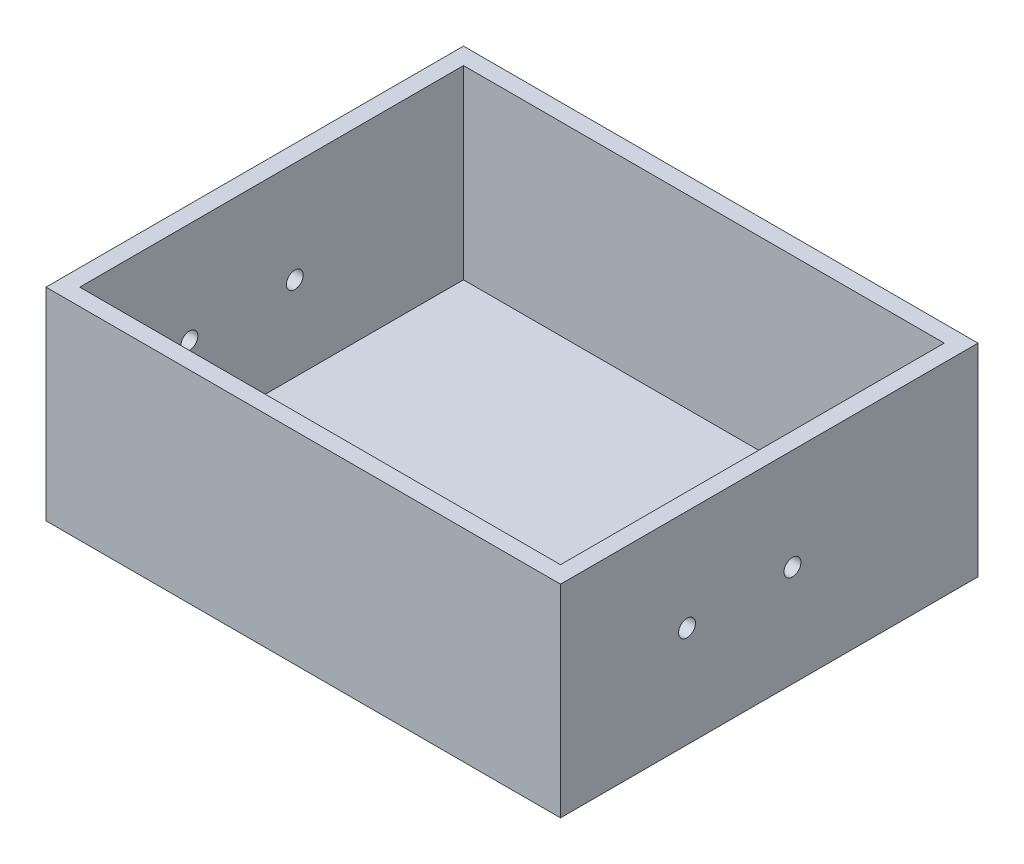
ISO-10303-21;
HEADER;
FILE_DESCRIPTION(('STEP AP214'),'2;1');
FILE_NAME('part.step','',(''),(''),'','','');
FILE_SCHEMA(('AUTOMOTIVE_DESIGN { 1 0 10303 214 1 1 1 1 }'));
ENDSEC;
DATA;
#1=APPLICATION_CONTEXT('core data for automotive mechanical design processes');
#2=APPLICATION_PROTOCOL_DEFINITION('international standard','automotive_design',2000,#1);
#3=PRODUCT_CONTEXT('',#1,'mechanical');
#4=PRODUCT('Part','Part','',(#3));
#5=PRODUCT_RELATED_PRODUCT_CATEGORY('part','',(#4));
#6=PRODUCT_DEFINITION_FORMATION('','',#4);
#7=PRODUCT_DEFINITION_CONTEXT('part definition',#1,'design');
#8=PRODUCT_DEFINITION('design','',#6,#7);
#9=PRODUCT_DEFINITION_SHAPE('','',#8);
#10=(LENGTH_UNIT() NAMED_UNIT(*) SI_UNIT(.MILLI.,.METRE.));
#11=(NAMED_UNIT(*) PLANE_ANGLE_UNIT() SI_UNIT($,.RADIAN.));
#12=(NAMED_UNIT(*) SI_UNIT($,.STERADIAN.) SOLID_ANGLE_UNIT());
#13=UNCERTAINTY_MEASURE_WITH_UNIT(LENGTH_MEASURE(1.E-05),#10,'distance_accuracy_value','');
#14=(GEOMETRIC_REPRESENTATION_CONTEXT(3) GLOBAL_UNCERTAINTY_ASSIGNED_CONTEXT((#13)) GLOBAL_UNIT_ASSIGNED_CONTEXT((#10,
#11,#12)) REPRESENTATION_CONTEXT('',''));
#15=CARTESIAN_POINT('',(0.,0.,0.));
#16=DIRECTION('',(0.,0.,1.));
#17=DIRECTION('',(1.,0.,0.));
#18=AXIS2_PLACEMENT_3D('',#15,#16,#17);
#19=CARTESIAN_POINT('',(-61.,48.,49.5));
#20=DIRECTION('',(1.,0.,0.));
#21=DIRECTION('',(0.,0.,-1.));
#22=AXIS2_PLACEMENT_3D('',#19,#20,#21);
#23=PLANE('',#22);
#24=CARTESIAN_POINT('',(-61.,24.,19.5));
#25=DIRECTION('',(1.,0.,0.));
#26=DIRECTION('',(0.,0.,-1.));
#27=AXIS2_PLACEMENT_3D('',#24,#25,#26);
#28=CIRCLE('',#27,2.00000000000001);
#29=CARTESIAN_POINT('',(-61.,24.,17.5));
#30=VERTEX_POINT('',#29);
#31=EDGE_CURVE('E179',#30,#30,#28,.T.);
#32=ORIENTED_EDGE('',*,*,#31,.T.);
#33=EDGE_LOOP('',(#32));
#34=FACE_BOUND('',#33,.T.);
#35=CARTESIAN_POINT('',(-61.,24.,-5.50000000000001));
#36=DIRECTION('',(1.,0.,0.));
#37=DIRECTION('',(0.,0.,-1.));
#38=AXIS2_PLACEMENT_3D('',#35,#36,#37);
#39=CIRCLE('',#38,2.);
#40=CARTESIAN_POINT('',(-61.,24.,-7.50000000000002));
#41=VERTEX_POINT('',#40);
#42=EDGE_CURVE('E194',#41,#41,#39,.T.);
#43=ORIENTED_EDGE('',*,*,#42,.T.);
#44=EDGE_LOOP('',(#43));
#45=FACE_BOUND('',#44,.T.);
#46=DIRECTION('',(0.,0.,1.));
#47=VECTOR('',#46,1.);
#48=CARTESIAN_POINT('',(-61.,0.,49.5));
#49=LINE('',#48,#47);
#50=CARTESIAN_POINT('',(-61.,0.,-49.5));
#51=VERTEX_POINT('',#50);
#52=CARTESIAN_POINT('',(-61.,0.,49.5));
#53=VERTEX_POINT('',#52);
#54=EDGE_CURVE('E154',#51,#53,#49,.T.);
#55=ORIENTED_EDGE('',*,*,#54,.T.);
#56=DIRECTION('',(0.,-1.,0.));
#57=VECTOR('',#56,1.);
#58=CARTESIAN_POINT('',(-61.,48.,49.5));
#59=LINE('',#58,#57);
#60=CARTESIAN_POINT('',(-61.,48.,49.5));
#61=VERTEX_POINT('',#60);
#62=EDGE_CURVE('E11',#61,#53,#59,.T.);
#63=ORIENTED_EDGE('',*,*,#62,.F.);
#64=DIRECTION('',(0.,0.,1.));
#65=VECTOR('',#64,1.);
#66=CARTESIAN_POINT('',(-61.,48.,49.5));
#67=LINE('',#66,#65);
#68=CARTESIAN_POINT('',(-61.,48.,-49.5));
#69=VERTEX_POINT('',#68);
#70=EDGE_CURVE('E158',#69,#61,#67,.T.);
#71=ORIENTED_EDGE('',*,*,#70,.F.);
#72=DIRECTION('',(0.,-1.,0.));
#73=VECTOR('',#72,1.);
#74=CARTESIAN_POINT('',(-61.,48.,-49.5));
#75=LINE('',#74,#73);
#76=EDGE_CURVE('E164',#69,#51,#75,.T.);
#77=ORIENTED_EDGE('',*,*,#76,.T.);
#78=EDGE_LOOP('',(#55,#63,#71,#77));
#79=FACE_BOUND('',#78,.T.);
#80=ADVANCED_FACE('F41',(#34,#45,#79),#23,.F.);
#81=CARTESIAN_POINT('',(61.,48.,49.5));
#82=DIRECTION('',(0.,0.,-1.));
#83=DIRECTION('',(-1.,0.,0.));
#84=AXIS2_PLACEMENT_3D('',#81,#82,#83);
#85=PLANE('',#84);
#86=DIRECTION('',(1.,0.,0.));
#87=VECTOR('',#86,1.);
#88=CARTESIAN_POINT('',(61.,0.,49.5));
#89=LINE('',#88,#87);
#90=CARTESIAN_POINT('',(61.,0.,49.5));
#91=VERTEX_POINT('',#90);
#92=EDGE_CURVE('E167',#53,#91,#89,.T.);
#93=ORIENTED_EDGE('',*,*,#92,.T.);
#94=DIRECTION('',(0.,-1.,0.));
#95=VECTOR('',#94,1.);
#96=CARTESIAN_POINT('',(61.,48.,49.5));
#97=LINE('',#96,#95);
#98=CARTESIAN_POINT('',(61.,48.,49.5));
#99=VERTEX_POINT('',#98);
#100=EDGE_CURVE('E49',#99,#91,#97,.T.);
#101=ORIENTED_EDGE('',*,*,#100,.F.);
#102=DIRECTION('',(1.,0.,0.));
#103=VECTOR('',#102,1.);
#104=CARTESIAN_POINT('',(61.,48.,49.5));
#105=LINE('',#104,#103);
#106=EDGE_CURVE('E94',#61,#99,#105,.T.);
#107=ORIENTED_EDGE('',*,*,#106,.F.);
#108=ORIENTED_EDGE('',*,*,#62,.T.);
#109=EDGE_LOOP('',(#93,#101,#107,#108));
#110=FACE_BOUND('',#109,.T.);
#111=ADVANCED_FACE('F217',(#110),#85,.F.);
#112=CARTESIAN_POINT('',(61.,48.,49.5));
#113=DIRECTION('',(-1.,0.,0.));
#114=DIRECTION('',(0.,0.,1.));
#115=AXIS2_PLACEMENT_3D('',#112,#113,#114);
#116=PLANE('',#115);
#117=CARTESIAN_POINT('',(61.,24.,19.5));
#118=DIRECTION('',(1.,0.,0.));
#119=DIRECTION('',(0.,0.,-1.));
#120=AXIS2_PLACEMENT_3D('',#117,#118,#119);
#121=CIRCLE('',#120,2.00000000000001);
#122=CARTESIAN_POINT('',(61.,24.,17.5));
#123=VERTEX_POINT('',#122);
#124=EDGE_CURVE('E184',#123,#123,#121,.T.);
#125=ORIENTED_EDGE('',*,*,#124,.F.);
#126=EDGE_LOOP('',(#125));
#127=FACE_BOUND('',#126,.T.);
#128=CARTESIAN_POINT('',(61.,24.,-5.50000000000001));
#129=DIRECTION('',(1.,0.,0.));
#130=DIRECTION('',(0.,0.,-1.));
#131=AXIS2_PLACEMENT_3D('',#128,#129,#130);
#132=CIRCLE('',#131,2.);
#133=CARTESIAN_POINT('',(61.,24.,-7.50000000000002));
#134=VERTEX_POINT('',#133);
#135=EDGE_CURVE('E189',#134,#134,#132,.T.);
#136=ORIENTED_EDGE('',*,*,#135,.F.);
#137=EDGE_LOOP('',(#136));
#138=FACE_BOUND('',#137,.T.);
#139=DIRECTION('',(0.,0.,-1.));
#140=VECTOR('',#139,1.);
#141=CARTESIAN_POINT('',(61.,0.,49.5));
#142=LINE('',#141,#140);
#143=CARTESIAN_POINT('',(61.,0.,-49.5));
#144=VERTEX_POINT('',#143);
#145=EDGE_CURVE('E169',#91,#144,#142,.T.);
#146=ORIENTED_EDGE('',*,*,#145,.T.);
#147=DIRECTION('',(0.,-1.,0.));
#148=VECTOR('',#147,1.);
#149=CARTESIAN_POINT('',(61.,48.,-49.5));
#150=LINE('',#149,#148);
#151=CARTESIAN_POINT('',(61.,48.,-49.5));
#152=VERTEX_POINT('',#151);
#153=EDGE_CURVE('E173',#152,#144,#150,.T.);
#154=ORIENTED_EDGE('',*,*,#153,.F.);
#155=DIRECTION('',(0.,0.,-1.));
#156=VECTOR('',#155,1.);
#157=CARTESIAN_POINT('',(61.,48.,49.5));
#158=LINE('',#157,#156);
#159=EDGE_CURVE('E161',#99,#152,#158,.T.);
#160=ORIENTED_EDGE('',*,*,#159,.F.);
#161=ORIENTED_EDGE('',*,*,#100,.T.);
#162=EDGE_LOOP('',(#146,#154,#160,#161));
#163=FACE_BOUND('',#162,.T.);
#164=ADVANCED_FACE('F221',(#127,#138,#163),#116,.F.);
#165=CARTESIAN_POINT('',(61.,48.,-49.5));
#166=DIRECTION('',(0.,0.,1.));
#167=DIRECTION('',(1.,0.,0.));
#168=AXIS2_PLACEMENT_3D('',#165,#166,#167);
#169=PLANE('',#168);
#170=DIRECTION('',(-1.,0.,0.));
#171=VECTOR('',#170,1.);
#172=CARTESIAN_POINT('',(61.,0.,-49.5));
#173=LINE('',#172,#171);
#174=EDGE_CURVE('E87',#144,#51,#173,.T.);
#175=ORIENTED_EDGE('',*,*,#174,.T.);
#176=ORIENTED_EDGE('',*,*,#76,.F.);
#177=DIRECTION('',(-1.,0.,0.));
#178=VECTOR('',#177,1.);
#179=CARTESIAN_POINT('',(61.,48.,-49.5));
#180=LINE('',#179,#178);
#181=EDGE_CURVE('E66',#152,#69,#180,.T.);
#182=ORIENTED_EDGE('',*,*,#181,.F.);
#183=ORIENTED_EDGE('',*,*,#153,.T.);
#184=EDGE_LOOP('',(#175,#176,#182,#183));
#185=FACE_BOUND('',#184,.T.);
#186=ADVANCED_FACE('F225',(#185),#169,.F.);
#187=CARTESIAN_POINT('',(0.,48.,0.));
#188=DIRECTION('',(0.,1.,0.));
#189=DIRECTION('',(0.,0.,1.));
#190=AXIS2_PLACEMENT_3D('',#187,#188,#189);
#191=PLANE('',#190);
#192=DIRECTION('',(0.,0.,-1.));
#193=VECTOR('',#192,1.);
#194=CARTESIAN_POINT('',(57.,48.,-45.5));
#195=LINE('',#194,#193);
#196=CARTESIAN_POINT('',(57.,48.,45.5));
#197=VERTEX_POINT('',#196);
#198=CARTESIAN_POINT('',(57.,48.,-45.5));
#199=VERTEX_POINT('',#198);
#200=EDGE_CURVE('E57',#197,#199,#195,.T.);
#201=ORIENTED_EDGE('',*,*,#200,.F.);
#202=DIRECTION('',(1.,0.,0.));
#203=VECTOR('',#202,1.);
#204=CARTESIAN_POINT('',(-57.,48.,45.5));
#205=LINE('',#204,#203);
#206=CARTESIAN_POINT('',(-57.,48.,45.5));
#207=VERTEX_POINT('',#206);
#208=EDGE_CURVE('E136',#207,#197,#205,.T.);
#209=ORIENTED_EDGE('',*,*,#208,.F.);
#210=DIRECTION('',(0.,0.,1.));
#211=VECTOR('',#210,1.);
#212=CARTESIAN_POINT('',(-57.,48.,-45.5));
#213=LINE('',#212,#211);
#214=CARTESIAN_POINT('',(-57.,48.,-45.5));
#215=VERTEX_POINT('',#214);
#216=EDGE_CURVE('E139',#215,#207,#213,.T.);
#217=ORIENTED_EDGE('',*,*,#216,.F.);
#218=DIRECTION('',(-1.,0.,0.));
#219=VECTOR('',#218,1.);
#220=CARTESIAN_POINT('',(-57.,48.,-45.5));
#221=LINE('',#220,#219);
#222=EDGE_CURVE('E148',#199,#215,#221,.T.);
#223=ORIENTED_EDGE('',*,*,#222,.F.);
#224=EDGE_LOOP('',(#201,#209,#217,#223));
#225=FACE_BOUND('',#224,.T.);
#226=ORIENTED_EDGE('',*,*,#70,.T.);
#227=ORIENTED_EDGE('',*,*,#106,.T.);
#228=ORIENTED_EDGE('',*,*,#159,.T.);
#229=ORIENTED_EDGE('',*,*,#181,.T.);
#230=EDGE_LOOP('',(#226,#227,#228,#229));
#231=FACE_BOUND('',#230,.T.);
#232=ADVANCED_FACE('F231',(#225,#231),#191,.T.);
#233=CARTESIAN_POINT('',(0.,0.,0.));
#234=DIRECTION('',(0.,1.,0.));
#235=DIRECTION('',(0.,0.,1.));
#236=AXIS2_PLACEMENT_3D('',#233,#234,#235);
#237=PLANE('',#236);
#238=ORIENTED_EDGE('',*,*,#54,.F.);
#239=ORIENTED_EDGE('',*,*,#174,.F.);
#240=ORIENTED_EDGE('',*,*,#145,.F.);
#241=ORIENTED_EDGE('',*,*,#92,.F.);
#242=EDGE_LOOP('',(#238,#239,#240,#241));
#243=FACE_BOUND('',#242,.T.);
#244=ADVANCED_FACE('F232',(#243),#237,.F.);
#245=CARTESIAN_POINT('',(57.,4.,-45.5));
#246=DIRECTION('',(1.,0.,0.));
#247=DIRECTION('',(0.,0.,-1.));
#248=AXIS2_PLACEMENT_3D('',#245,#246,#247);
#249=PLANE('',#248);
#250=CARTESIAN_POINT('',(57.,24.,19.5));
#251=DIRECTION('',(1.,0.,0.));
#252=DIRECTION('',(0.,0.,-1.));
#253=AXIS2_PLACEMENT_3D('',#250,#251,#252);
#254=CIRCLE('',#253,2.00000000000001);
#255=CARTESIAN_POINT('',(57.,24.,17.5));
#256=VERTEX_POINT('',#255);
#257=EDGE_CURVE('E142',#256,#256,#254,.T.);
#258=ORIENTED_EDGE('',*,*,#257,.T.);
#259=EDGE_LOOP('',(#258));
#260=FACE_BOUND('',#259,.T.);
#261=CARTESIAN_POINT('',(57.,24.,-5.50000000000001));
#262=DIRECTION('',(1.,0.,0.));
#263=DIRECTION('',(0.,0.,-1.));
#264=AXIS2_PLACEMENT_3D('',#261,#262,#263);
#265=CIRCLE('',#264,2.);
#266=CARTESIAN_POINT('',(57.,24.,-7.50000000000002));
#267=VERTEX_POINT('',#266);
#268=EDGE_CURVE('E178',#267,#267,#265,.T.);
#269=ORIENTED_EDGE('',*,*,#268,.T.);
#270=EDGE_LOOP('',(#269));
#271=FACE_BOUND('',#270,.T.);
#272=ORIENTED_EDGE('',*,*,#200,.T.);
#273=DIRECTION('',(0.,1.,0.));
#274=VECTOR('',#273,1.);
#275=CARTESIAN_POINT('',(57.,4.,-45.5));
#276=LINE('',#275,#274);
#277=CARTESIAN_POINT('',(57.,4.,-45.5));
#278=VERTEX_POINT('',#277);
#279=EDGE_CURVE('E114',#278,#199,#276,.T.);
#280=ORIENTED_EDGE('',*,*,#279,.F.);
#281=DIRECTION('',(0.,0.,-1.));
#282=VECTOR('',#281,1.);
#283=CARTESIAN_POINT('',(57.,4.,-45.5));
#284=LINE('',#283,#282);
#285=CARTESIAN_POINT('',(57.,4.,45.5));
#286=VERTEX_POINT('',#285);
#287=EDGE_CURVE('E118',#286,#278,#284,.T.);
#288=ORIENTED_EDGE('',*,*,#287,.F.);
#289=DIRECTION('',(0.,1.,0.));
#290=VECTOR('',#289,1.);
#291=CARTESIAN_POINT('',(57.,4.,45.5));
#292=LINE('',#291,#290);
#293=EDGE_CURVE('E152',#286,#197,#292,.T.);
#294=ORIENTED_EDGE('',*,*,#293,.T.);
#295=EDGE_LOOP('',(#272,#280,#288,#294));
#296=FACE_BOUND('',#295,.T.);
#297=ADVANCED_FACE('F116',(#260,#271,#296),#249,.F.);
#298=CARTESIAN_POINT('',(-57.,4.,45.5));
#299=DIRECTION('',(0.,0.,1.));
#300=DIRECTION('',(1.,0.,0.));
#301=AXIS2_PLACEMENT_3D('',#298,#299,#300);
#302=PLANE('',#301);
#303=ORIENTED_EDGE('',*,*,#208,.T.);
#304=ORIENTED_EDGE('',*,*,#293,.F.);
#305=DIRECTION('',(1.,0.,0.));
#306=VECTOR('',#305,1.);
#307=CARTESIAN_POINT('',(-57.,4.,45.5));
#308=LINE('',#307,#306);
#309=CARTESIAN_POINT('',(-57.,4.,45.5));
#310=VERTEX_POINT('',#309);
#311=EDGE_CURVE('E124',#310,#286,#308,.T.);
#312=ORIENTED_EDGE('',*,*,#311,.F.);
#313=DIRECTION('',(0.,1.,0.));
#314=VECTOR('',#313,1.);
#315=CARTESIAN_POINT('',(-57.,4.,45.5));
#316=LINE('',#315,#314);
#317=EDGE_CURVE('E155',#310,#207,#316,.T.);
#318=ORIENTED_EDGE('',*,*,#317,.T.);
#319=EDGE_LOOP('',(#303,#304,#312,#318));
#320=FACE_BOUND('',#319,.T.);
#321=ADVANCED_FACE('F241',(#320),#302,.F.);
#322=CARTESIAN_POINT('',(-57.,4.,-45.5));
#323=DIRECTION('',(-1.,0.,0.));
#324=DIRECTION('',(0.,0.,1.));
#325=AXIS2_PLACEMENT_3D('',#322,#323,#324);
#326=PLANE('',#325);
#327=CARTESIAN_POINT('',(-57.,24.,19.5));
#328=DIRECTION('',(-1.,0.,0.));
#329=DIRECTION('',(0.,0.,1.));
#330=AXIS2_PLACEMENT_3D('',#327,#328,#329);
#331=CIRCLE('',#330,2.00000000000001);
#332=CARTESIAN_POINT('',(-57.,24.,17.5));
#333=VERTEX_POINT('',#332);
#334=EDGE_CURVE('E44',#333,#333,#331,.T.);
#335=ORIENTED_EDGE('',*,*,#334,.T.);
#336=EDGE_LOOP('',(#335));
#337=FACE_BOUND('',#336,.T.);
#338=CARTESIAN_POINT('',(-57.,24.,-5.50000000000001));
#339=DIRECTION('',(-1.,0.,0.));
#340=DIRECTION('',(0.,0.,1.));
#341=AXIS2_PLACEMENT_3D('',#338,#339,#340);
#342=CIRCLE('',#341,2.);
#343=CARTESIAN_POINT('',(-57.,24.,-7.50000000000002));
#344=VERTEX_POINT('',#343);
#345=EDGE_CURVE('E176',#344,#344,#342,.T.);
#346=ORIENTED_EDGE('',*,*,#345,.T.);
#347=EDGE_LOOP('',(#346));
#348=FACE_BOUND('',#347,.T.);
#349=ORIENTED_EDGE('',*,*,#216,.T.);
#350=ORIENTED_EDGE('',*,*,#317,.F.);
#351=DIRECTION('',(0.,0.,1.));
#352=VECTOR('',#351,1.);
#353=CARTESIAN_POINT('',(-57.,4.,-45.5));
#354=LINE('',#353,#352);
#355=CARTESIAN_POINT('',(-57.,4.,-45.5));
#356=VERTEX_POINT('',#355);
#357=EDGE_CURVE('E132',#356,#310,#354,.T.);
#358=ORIENTED_EDGE('',*,*,#357,.F.);
#359=DIRECTION('',(0.,1.,0.));
#360=VECTOR('',#359,1.);
#361=CARTESIAN_POINT('',(-57.,4.,-45.5));
#362=LINE('',#361,#360);
#363=EDGE_CURVE('E123',#356,#215,#362,.T.);
#364=ORIENTED_EDGE('',*,*,#363,.T.);
#365=EDGE_LOOP('',(#349,#350,#358,#364));
#366=FACE_BOUND('',#365,.T.);
#367=ADVANCED_FACE('F245',(#337,#348,#366),#326,.F.);
#368=CARTESIAN_POINT('',(-57.,4.,-45.5));
#369=DIRECTION('',(0.,0.,-1.));
#370=DIRECTION('',(-1.,0.,0.));
#371=AXIS2_PLACEMENT_3D('',#368,#369,#370);
#372=PLANE('',#371);
#373=ORIENTED_EDGE('',*,*,#222,.T.);
#374=ORIENTED_EDGE('',*,*,#363,.F.);
#375=DIRECTION('',(-1.,0.,0.));
#376=VECTOR('',#375,1.);
#377=CARTESIAN_POINT('',(-57.,4.,-45.5));
#378=LINE('',#377,#376);
#379=EDGE_CURVE('E127',#278,#356,#378,.T.);
#380=ORIENTED_EDGE('',*,*,#379,.F.);
#381=ORIENTED_EDGE('',*,*,#279,.T.);
#382=EDGE_LOOP('',(#373,#374,#380,#381));
#383=FACE_BOUND('',#382,.T.);
#384=ADVANCED_FACE('F128',(#383),#372,.F.);
#385=CARTESIAN_POINT('',(0.,4.,0.));
#386=DIRECTION('',(0.,1.,0.));
#387=DIRECTION('',(0.,0.,1.));
#388=AXIS2_PLACEMENT_3D('',#385,#386,#387);
#389=PLANE('',#388);
#390=ORIENTED_EDGE('',*,*,#287,.T.);
#391=ORIENTED_EDGE('',*,*,#379,.T.);
#392=ORIENTED_EDGE('',*,*,#357,.T.);
#393=ORIENTED_EDGE('',*,*,#311,.T.);
#394=EDGE_LOOP('',(#390,#391,#392,#393));
#395=FACE_BOUND('',#394,.T.);
#396=ADVANCED_FACE('F134',(#395),#389,.T.);
#397=CARTESIAN_POINT('',(-61.,24.,-5.50000000000001));
#398=DIRECTION('',(1.,0.,0.));
#399=DIRECTION('',(0.,0.,-1.));
#400=AXIS2_PLACEMENT_3D('',#397,#398,#399);
#401=CYLINDRICAL_SURFACE('',#400,2.);
#402=CARTESIAN_POINT('',(-61.,24.,-7.50000000000002));
#403=CARTESIAN_POINT('',(-60.9583333333333,24.,-7.50000000000002));
#404=CARTESIAN_POINT('',(-60.9166666666667,24.,-7.50000000000002));
#405=CARTESIAN_POINT('',(-60.8333333333333,24.,-7.50000000000002));
#406=CARTESIAN_POINT('',(-60.7916666666667,24.,-7.50000000000002));
#407=CARTESIAN_POINT('',(-60.7083333333333,24.,-7.50000000000002));
#408=CARTESIAN_POINT('',(-60.6666666666667,24.,-7.50000000000002));
#409=CARTESIAN_POINT('',(-60.5833333333333,24.,-7.50000000000002));
#410=CARTESIAN_POINT('',(-60.5416666666667,24.,-7.50000000000002));
#411=CARTESIAN_POINT('',(-60.4583333333333,24.,-7.50000000000002));
#412=CARTESIAN_POINT('',(-60.4166666666667,24.,-7.50000000000002));
#413=CARTESIAN_POINT('',(-60.3333333333333,24.,-7.50000000000002));
#414=CARTESIAN_POINT('',(-60.2916666666667,24.,-7.50000000000002));
#415=CARTESIAN_POINT('',(-60.2083333333333,24.,-7.50000000000002));
#416=CARTESIAN_POINT('',(-60.1666666666667,24.,-7.50000000000002));
#417=CARTESIAN_POINT('',(-60.0833333333333,24.,-7.50000000000002));
#418=CARTESIAN_POINT('',(-60.0416666666667,24.,-7.50000000000002));
#419=CARTESIAN_POINT('',(-59.9583333333333,24.,-7.50000000000002));
#420=CARTESIAN_POINT('',(-59.9166666666667,24.,-7.50000000000002));
#421=CARTESIAN_POINT('',(-59.8333333333333,24.,-7.50000000000002));
#422=CARTESIAN_POINT('',(-59.7916666666667,24.,-7.50000000000002));
#423=CARTESIAN_POINT('',(-59.7083333333333,24.,-7.50000000000002));
#424=CARTESIAN_POINT('',(-59.6666666666667,24.,-7.50000000000002));
#425=CARTESIAN_POINT('',(-59.5833333333333,24.,-7.50000000000002));
#426=CARTESIAN_POINT('',(-59.5416666666667,24.,-7.50000000000002));
#427=CARTESIAN_POINT('',(-59.4583333333333,24.,-7.50000000000002));
#428=CARTESIAN_POINT('',(-59.4166666666667,24.,-7.50000000000002));
#429=CARTESIAN_POINT('',(-59.3333333333333,24.,-7.50000000000002));
#430=CARTESIAN_POINT('',(-59.2916666666667,24.,-7.50000000000002));
#431=CARTESIAN_POINT('',(-59.2083333333333,24.,-7.50000000000002));
#432=CARTESIAN_POINT('',(-59.1666666666667,24.,-7.50000000000002));
#433=CARTESIAN_POINT('',(-59.0833333333333,24.,-7.50000000000002));
#434=CARTESIAN_POINT('',(-59.0416666666667,24.,-7.50000000000002));
#435=CARTESIAN_POINT('',(-58.9583333333333,24.,-7.50000000000002));
#436=CARTESIAN_POINT('',(-58.9166666666667,24.,-7.50000000000002));
#437=CARTESIAN_POINT('',(-58.8333333333333,24.,-7.50000000000002));
#438=CARTESIAN_POINT('',(-58.7916666666667,24.,-7.50000000000002));
#439=CARTESIAN_POINT('',(-58.7083333333333,24.,-7.50000000000002));
#440=CARTESIAN_POINT('',(-58.6666666666667,24.,-7.50000000000002));
#441=CARTESIAN_POINT('',(-58.5833333333333,24.,-7.50000000000002));
#442=CARTESIAN_POINT('',(-58.5416666666667,24.,-7.50000000000002));
#443=CARTESIAN_POINT('',(-58.4583333333333,24.,-7.50000000000002));
#444=CARTESIAN_POINT('',(-58.4166666666667,24.,-7.50000000000002));
#445=CARTESIAN_POINT('',(-58.3333333333333,24.,-7.50000000000002));
#446=CARTESIAN_POINT('',(-58.2916666666667,24.,-7.50000000000002));
#447=CARTESIAN_POINT('',(-58.2083333333333,24.,-7.50000000000002));
#448=CARTESIAN_POINT('',(-58.1666666666667,24.,-7.50000000000002));
#449=CARTESIAN_POINT('',(-58.0833333333333,24.,-7.50000000000002));
#450=CARTESIAN_POINT('',(-58.0416666666667,24.,-7.50000000000002));
#451=CARTESIAN_POINT('',(-57.9583333333333,24.,-7.50000000000002));
#452=CARTESIAN_POINT('',(-57.9166666666667,24.,-7.50000000000002));
#453=CARTESIAN_POINT('',(-57.8333333333333,24.,-7.50000000000002));
#454=CARTESIAN_POINT('',(-57.7916666666667,24.,-7.50000000000002));
#455=CARTESIAN_POINT('',(-57.7083333333333,24.,-7.50000000000002));
#456=CARTESIAN_POINT('',(-57.6666666666667,24.,-7.50000000000002));
#457=CARTESIAN_POINT('',(-57.5833333333333,24.,-7.50000000000002));
#458=CARTESIAN_POINT('',(-57.5416666666667,24.,-7.50000000000002));
#459=CARTESIAN_POINT('',(-57.4583333333333,24.,-7.50000000000002));
#460=CARTESIAN_POINT('',(-57.4166666666667,24.,-7.50000000000002));
#461=CARTESIAN_POINT('',(-57.3333333333333,24.,-7.50000000000002));
#462=CARTESIAN_POINT('',(-57.2916666666667,24.,-7.50000000000002));
#463=CARTESIAN_POINT('',(-57.2083333333333,24.,-7.50000000000002));
#464=CARTESIAN_POINT('',(-57.1666666666667,24.,-7.50000000000002));
#465=CARTESIAN_POINT('',(-57.0833333333333,24.,-7.50000000000002));
#466=CARTESIAN_POINT('',(-57.0416666666667,24.,-7.50000000000002));
#467=CARTESIAN_POINT('',(-57.,24.,-7.50000000000002));
#468=B_SPLINE_CURVE_WITH_KNOTS('',3,(#402,#403,#404,#405,#406,#407,#408,#409,#410,#411,#412,
#413,#414,#415,#416,#417,#418,#419,#420,#421,#422,#423,#424,#425,#426,#427,#428,#429,#430,#431,
#432,#433,#434,#435,#436,#437,#438,#439,#440,#441,#442,#443,#444,#445,#446,#447,#448,#449,#450,
#451,#452,#453,#454,#455,#456,#457,#458,#459,#460,#461,#462,#463,#464,#465,#466,#467),
.UNSPECIFIED.,.F.,.F.,(4,2,2,2,2,2,2,2,2,2,2,2,2,2,2,2,2,2,2,2,2,2,2,2,2,2,2,2,2,2,2,2,4),(0.,
0.125,0.25,0.375,0.5,0.625000000000001,0.750000000000001,0.875000000000001,1.,1.125,1.25,
1.37500000000001,1.50000000000001,1.62500000000001,1.75000000000001,1.87500000000001,
2.00000000000001,2.12500000000001,2.25000000000001,2.37500000000001,2.50000000000001,
2.62500000000001,2.75000000000001,2.87500000000002,3.00000000000002,3.12500000000002,
3.25000000000002,3.37500000000002,3.50000000000002,3.62500000000002,3.75000000000002,
3.87500000000002,4.00000000000002),.UNSPECIFIED.);
#469=EDGE_CURVE('BSEAM200',#41,#344,#468,.T.);
#470=ORIENTED_EDGE('',*,*,#42,.F.);
#471=ORIENTED_EDGE('',*,*,#345,.F.);
#472=ORIENTED_EDGE('',*,*,#469,.T.);
#473=ORIENTED_EDGE('',*,*,#469,.F.);
#474=EDGE_LOOP('',(#470,#472,#471,#473));
#475=FACE_BOUND('',#474,.T.);
#476=ADVANCED_FACE('F200',(#475),#401,.F.);
#477=CARTESIAN_POINT('',(-61.,24.,19.5));
#478=DIRECTION('',(1.,0.,0.));
#479=DIRECTION('',(0.,0.,-1.));
#480=AXIS2_PLACEMENT_3D('',#477,#478,#479);
#481=CYLINDRICAL_SURFACE('',#480,2.00000000000001);
#482=CARTESIAN_POINT('',(-61.,24.,17.5));
#483=CARTESIAN_POINT('',(-60.9583333333333,24.,17.5));
#484=CARTESIAN_POINT('',(-60.9166666666667,24.,17.5));
#485=CARTESIAN_POINT('',(-60.8333333333333,24.,17.5));
#486=CARTESIAN_POINT('',(-60.7916666666667,24.,17.5));
#487=CARTESIAN_POINT('',(-60.7083333333333,24.,17.5));
#488=CARTESIAN_POINT('',(-60.6666666666667,24.,17.5));
#489=CARTESIAN_POINT('',(-60.5833333333333,24.,17.5));
#490=CARTESIAN_POINT('',(-60.5416666666667,24.,17.5));
#491=CARTESIAN_POINT('',(-60.4583333333333,24.,17.5));
#492=CARTESIAN_POINT('',(-60.4166666666667,24.,17.5));
#493=CARTESIAN_POINT('',(-60.3333333333333,24.,17.5));
#494=CARTESIAN_POINT('',(-60.2916666666667,24.,17.5));
#495=CARTESIAN_POINT('',(-60.2083333333333,24.,17.5));
#496=CARTESIAN_POINT('',(-60.1666666666667,24.,17.5));
#497=CARTESIAN_POINT('',(-60.0833333333333,24.,17.5));
#498=CARTESIAN_POINT('',(-60.0416666666667,24.,17.5));
#499=CARTESIAN_POINT('',(-59.9583333333333,24.,17.5));
#500=CARTESIAN_POINT('',(-59.9166666666667,24.,17.5));
#501=CARTESIAN_POINT('',(-59.8333333333333,24.,17.5));
#502=CARTESIAN_POINT('',(-59.7916666666667,24.,17.5));
#503=CARTESIAN_POINT('',(-59.7083333333333,24.,17.5));
#504=CARTESIAN_POINT('',(-59.6666666666667,24.,17.5));
#505=CARTESIAN_POINT('',(-59.5833333333333,24.,17.5));
#506=CARTESIAN_POINT('',(-59.5416666666667,24.,17.5));
#507=CARTESIAN_POINT('',(-59.4583333333333,24.,17.5));
#508=CARTESIAN_POINT('',(-59.4166666666667,24.,17.5));
#509=CARTESIAN_POINT('',(-59.3333333333333,24.,17.5));
#510=CARTESIAN_POINT('',(-59.2916666666667,24.,17.5));
#511=CARTESIAN_POINT('',(-59.2083333333333,24.,17.5));
#512=CARTESIAN_POINT('',(-59.1666666666667,24.,17.5));
#513=CARTESIAN_POINT('',(-59.0833333333333,24.,17.5));
#514=CARTESIAN_POINT('',(-59.0416666666667,24.,17.5));
#515=CARTESIAN_POINT('',(-58.9583333333333,24.,17.5));
#516=CARTESIAN_POINT('',(-58.9166666666667,24.,17.5));
#517=CARTESIAN_POINT('',(-58.8333333333333,24.,17.5));
#518=CARTESIAN_POINT('',(-58.7916666666667,24.,17.5));
#519=CARTESIAN_POINT('',(-58.7083333333333,24.,17.5));
#520=CARTESIAN_POINT('',(-58.6666666666667,24.,17.5));
#521=CARTESIAN_POINT('',(-58.5833333333333,24.,17.5));
#522=CARTESIAN_POINT('',(-58.5416666666667,24.,17.5));
#523=CARTESIAN_POINT('',(-58.4583333333333,24.,17.5));
#524=CARTESIAN_POINT('',(-58.4166666666667,24.,17.5));
#525=CARTESIAN_POINT('',(-58.3333333333333,24.,17.5));
#526=CARTESIAN_POINT('',(-58.2916666666667,24.,17.5));
#527=CARTESIAN_POINT('',(-58.2083333333333,24.,17.5));
#528=CARTESIAN_POINT('',(-58.1666666666667,24.,17.5));
#529=CARTESIAN_POINT('',(-58.0833333333333,24.,17.5));
#530=CARTESIAN_POINT('',(-58.0416666666667,24.,17.5));
#531=CARTESIAN_POINT('',(-57.9583333333333,24.,17.5));
#532=CARTESIAN_POINT('',(-57.9166666666667,24.,17.5));
#533=CARTESIAN_POINT('',(-57.8333333333333,24.,17.5));
#534=CARTESIAN_POINT('',(-57.7916666666667,24.,17.5));
#535=CARTESIAN_POINT('',(-57.7083333333333,24.,17.5));
#536=CARTESIAN_POINT('',(-57.6666666666667,24.,17.5));
#537=CARTESIAN_POINT('',(-57.5833333333333,24.,17.5));
#538=CARTESIAN_POINT('',(-57.5416666666667,24.,17.5));
#539=CARTESIAN_POINT('',(-57.4583333333333,24.,17.5));
#540=CARTESIAN_POINT('',(-57.4166666666667,24.,17.5));
#541=CARTESIAN_POINT('',(-57.3333333333333,24.,17.5));
#542=CARTESIAN_POINT('',(-57.2916666666667,24.,17.5));
#543=CARTESIAN_POINT('',(-57.2083333333333,24.,17.5));
#544=CARTESIAN_POINT('',(-57.1666666666667,24.,17.5));
#545=CARTESIAN_POINT('',(-57.0833333333333,24.,17.5));
#546=CARTESIAN_POINT('',(-57.0416666666667,24.,17.5));
#547=CARTESIAN_POINT('',(-57.,24.,17.5));
#548=B_SPLINE_CURVE_WITH_KNOTS('',3,(#482,#483,#484,#485,#486,#487,#488,#489,#490,#491,#492,
#493,#494,#495,#496,#497,#498,#499,#500,#501,#502,#503,#504,#505,#506,#507,#508,#509,#510,#511,
#512,#513,#514,#515,#516,#517,#518,#519,#520,#521,#522,#523,#524,#525,#526,#527,#528,#529,#530,
#531,#532,#533,#534,#535,#536,#537,#538,#539,#540,#541,#542,#543,#544,#545,#546,#547),
.UNSPECIFIED.,.F.,.F.,(4,2,2,2,2,2,2,2,2,2,2,2,2,2,2,2,2,2,2,2,2,2,2,2,2,2,2,2,2,2,2,2,4),(0.,
0.125,0.25,0.375,0.5,0.625000000000001,0.750000000000001,0.875000000000001,1.,1.125,1.25,
1.37500000000001,1.50000000000001,1.62500000000001,1.75000000000001,1.87500000000001,
2.00000000000001,2.12500000000001,2.25000000000001,2.37500000000001,2.50000000000001,
2.62500000000001,2.75000000000001,2.87500000000002,3.00000000000002,3.12500000000002,
3.25000000000002,3.37500000000002,3.50000000000002,3.62500000000002,3.75000000000002,
3.87500000000002,4.00000000000002),.UNSPECIFIED.);
#549=EDGE_CURVE('BSEAM203',#30,#333,#548,.T.);
#550=ORIENTED_EDGE('',*,*,#31,.F.);
#551=ORIENTED_EDGE('',*,*,#334,.F.);
#552=ORIENTED_EDGE('',*,*,#549,.T.);
#553=ORIENTED_EDGE('',*,*,#549,.F.);
#554=EDGE_LOOP('',(#550,#552,#551,#553));
#555=FACE_BOUND('',#554,.T.);
#556=ADVANCED_FACE('F203',(#555),#481,.F.);
#557=CARTESIAN_POINT('',(61.,24.,-7.50000000000002));
#558=CARTESIAN_POINT('',(60.9583333333333,24.,-7.50000000000002));
#559=CARTESIAN_POINT('',(60.9166666666667,24.,-7.50000000000002));
#560=CARTESIAN_POINT('',(60.8333333333333,24.,-7.50000000000002));
#561=CARTESIAN_POINT('',(60.7916666666667,24.,-7.50000000000002));
#562=CARTESIAN_POINT('',(60.7083333333333,24.,-7.50000000000002));
#563=CARTESIAN_POINT('',(60.6666666666666,24.,-7.50000000000002));
#564=CARTESIAN_POINT('',(60.5833333333333,24.,-7.50000000000002));
#565=CARTESIAN_POINT('',(60.5416666666666,24.,-7.50000000000002));
#566=CARTESIAN_POINT('',(60.4583333333333,24.,-7.50000000000002));
#567=CARTESIAN_POINT('',(60.4166666666666,24.,-7.50000000000002));
#568=CARTESIAN_POINT('',(60.3333333333333,24.,-7.50000000000002));
#569=CARTESIAN_POINT('',(60.2916666666666,24.,-7.50000000000002));
#570=CARTESIAN_POINT('',(60.2083333333333,24.,-7.50000000000002));
#571=CARTESIAN_POINT('',(60.1666666666666,24.,-7.50000000000002));
#572=CARTESIAN_POINT('',(60.0833333333333,24.,-7.50000000000002));
#573=CARTESIAN_POINT('',(60.0416666666666,24.,-7.50000000000002));
#574=CARTESIAN_POINT('',(59.9583333333333,24.,-7.50000000000002));
#575=CARTESIAN_POINT('',(59.9166666666666,24.,-7.50000000000002));
#576=CARTESIAN_POINT('',(59.8333333333333,24.,-7.50000000000002));
#577=CARTESIAN_POINT('',(59.7916666666666,24.,-7.50000000000002));
#578=CARTESIAN_POINT('',(59.7083333333333,24.,-7.50000000000002));
#579=CARTESIAN_POINT('',(59.6666666666666,24.,-7.50000000000002));
#580=CARTESIAN_POINT('',(59.5833333333333,24.,-7.50000000000002));
#581=CARTESIAN_POINT('',(59.5416666666666,24.,-7.50000000000002));
#582=CARTESIAN_POINT('',(59.4583333333333,24.,-7.50000000000002));
#583=CARTESIAN_POINT('',(59.4166666666666,24.,-7.50000000000002));
#584=CARTESIAN_POINT('',(59.3333333333333,24.,-7.50000000000002));
#585=CARTESIAN_POINT('',(59.2916666666666,24.,-7.50000000000002));
#586=CARTESIAN_POINT('',(59.2083333333333,24.,-7.50000000000002));
#587=CARTESIAN_POINT('',(59.1666666666666,24.,-7.50000000000002));
#588=CARTESIAN_POINT('',(59.0833333333333,24.,-7.50000000000002));
#589=CARTESIAN_POINT('',(59.0416666666666,24.,-7.50000000000002));
#590=CARTESIAN_POINT('',(58.9583333333333,24.,-7.50000000000002));
#591=CARTESIAN_POINT('',(58.9166666666666,24.,-7.50000000000002));
#592=CARTESIAN_POINT('',(58.8333333333333,24.,-7.50000000000002));
#593=CARTESIAN_POINT('',(58.7916666666666,24.,-7.50000000000002));
#594=CARTESIAN_POINT('',(58.7083333333333,24.,-7.50000000000002));
#595=CARTESIAN_POINT('',(58.6666666666666,24.,-7.50000000000002));
#596=CARTESIAN_POINT('',(58.5833333333333,24.,-7.50000000000002));
#597=CARTESIAN_POINT('',(58.5416666666666,24.,-7.50000000000002));
#598=CARTESIAN_POINT('',(58.4583333333333,24.,-7.50000000000002));
#599=CARTESIAN_POINT('',(58.4166666666666,24.,-7.50000000000002));
#600=CARTESIAN_POINT('',(58.3333333333333,24.,-7.50000000000002));
#601=CARTESIAN_POINT('',(58.2916666666666,24.,-7.50000000000002));
#602=CARTESIAN_POINT('',(58.2083333333333,24.,-7.50000000000002));
#603=CARTESIAN_POINT('',(58.1666666666666,24.,-7.50000000000002));
#604=CARTESIAN_POINT('',(58.0833333333333,24.,-7.50000000000002));
#605=CARTESIAN_POINT('',(58.0416666666666,24.,-7.50000000000002));
#606=CARTESIAN_POINT('',(57.9583333333333,24.,-7.50000000000002));
#607=CARTESIAN_POINT('',(57.9166666666666,24.,-7.50000000000002));
#608=CARTESIAN_POINT('',(57.8333333333333,24.,-7.50000000000002));
#609=CARTESIAN_POINT('',(57.7916666666666,24.,-7.50000000000002));
#610=CARTESIAN_POINT('',(57.7083333333333,24.,-7.50000000000002));
#611=CARTESIAN_POINT('',(57.6666666666666,24.,-7.50000000000002));
#612=CARTESIAN_POINT('',(57.5833333333333,24.,-7.50000000000002));
#613=CARTESIAN_POINT('',(57.5416666666666,24.,-7.50000000000002));
#614=CARTESIAN_POINT('',(57.4583333333333,24.,-7.50000000000002));
#615=CARTESIAN_POINT('',(57.4166666666666,24.,-7.50000000000002));
#616=CARTESIAN_POINT('',(57.3333333333333,24.,-7.50000000000002));
#617=CARTESIAN_POINT('',(57.2916666666666,24.,-7.50000000000002));
#618=CARTESIAN_POINT('',(57.2083333333333,24.,-7.50000000000002));
#619=CARTESIAN_POINT('',(57.1666666666666,24.,-7.50000000000002));
#620=CARTESIAN_POINT('',(57.0833333333333,24.,-7.50000000000002));
#621=CARTESIAN_POINT('',(57.0416666666666,24.,-7.50000000000002));
#622=CARTESIAN_POINT('',(57.,24.,-7.50000000000002));
#623=B_SPLINE_CURVE_WITH_KNOTS('',3,(#557,#558,#559,#560,#561,#562,#563,#564,#565,#566,#567,
#568,#569,#570,#571,#572,#573,#574,#575,#576,#577,#578,#579,#580,#581,#582,#583,#584,#585,#586,
#587,#588,#589,#590,#591,#592,#593,#594,#595,#596,#597,#598,#599,#600,#601,#602,#603,#604,#605,
#606,#607,#608,#609,#610,#611,#612,#613,#614,#615,#616,#617,#618,#619,#620,#621,#622),
.UNSPECIFIED.,.F.,.F.,(4,2,2,2,2,2,2,2,2,2,2,2,2,2,2,2,2,2,2,2,2,2,2,2,2,2,2,2,2,2,2,2,4),(0.,
0.125,0.25,0.375,0.5,0.625000000000001,0.750000000000001,0.875000000000001,1.,1.125,1.25,1.375,
1.5,1.625,1.75,1.875,2.,2.125,2.25,2.375,2.5,2.625,2.75,2.875,3.,3.125,3.25,3.375,3.5,3.625,
3.75,3.875,4.),.UNSPECIFIED.);
#624=EDGE_CURVE('BSEAM205',#134,#267,#623,.T.);
#625=ORIENTED_EDGE('',*,*,#135,.T.);
#626=ORIENTED_EDGE('',*,*,#268,.F.);
#627=ORIENTED_EDGE('',*,*,#624,.T.);
#628=ORIENTED_EDGE('',*,*,#624,.F.);
#629=EDGE_LOOP('',(#625,#627,#626,#628));
#630=FACE_BOUND('',#629,.T.);
#631=ADVANCED_FACE('F205',(#630),#401,.F.);
#632=CARTESIAN_POINT('',(61.,24.,17.5));
#633=CARTESIAN_POINT('',(60.9583333333333,24.,17.5));
#634=CARTESIAN_POINT('',(60.9166666666667,24.,17.5));
#635=CARTESIAN_POINT('',(60.8333333333333,24.,17.5));
#636=CARTESIAN_POINT('',(60.7916666666667,24.,17.5));
#637=CARTESIAN_POINT('',(60.7083333333333,24.,17.5));
#638=CARTESIAN_POINT('',(60.6666666666666,24.,17.5));
#639=CARTESIAN_POINT('',(60.5833333333333,24.,17.5));
#640=CARTESIAN_POINT('',(60.5416666666666,24.,17.5));
#641=CARTESIAN_POINT('',(60.4583333333333,24.,17.5));
#642=CARTESIAN_POINT('',(60.4166666666666,24.,17.5));
#643=CARTESIAN_POINT('',(60.3333333333333,24.,17.5));
#644=CARTESIAN_POINT('',(60.2916666666666,24.,17.5));
#645=CARTESIAN_POINT('',(60.2083333333333,24.,17.5));
#646=CARTESIAN_POINT('',(60.1666666666666,24.,17.5));
#647=CARTESIAN_POINT('',(60.0833333333333,24.,17.5));
#648=CARTESIAN_POINT('',(60.0416666666666,24.,17.5));
#649=CARTESIAN_POINT('',(59.9583333333333,24.,17.5));
#650=CARTESIAN_POINT('',(59.9166666666666,24.,17.5));
#651=CARTESIAN_POINT('',(59.8333333333333,24.,17.5));
#652=CARTESIAN_POINT('',(59.7916666666666,24.,17.5));
#653=CARTESIAN_POINT('',(59.7083333333333,24.,17.5));
#654=CARTESIAN_POINT('',(59.6666666666666,24.,17.5));
#655=CARTESIAN_POINT('',(59.5833333333333,24.,17.5));
#656=CARTESIAN_POINT('',(59.5416666666666,24.,17.5));
#657=CARTESIAN_POINT('',(59.4583333333333,24.,17.5));
#658=CARTESIAN_POINT('',(59.4166666666666,24.,17.5));
#659=CARTESIAN_POINT('',(59.3333333333333,24.,17.5));
#660=CARTESIAN_POINT('',(59.2916666666666,24.,17.5));
#661=CARTESIAN_POINT('',(59.2083333333333,24.,17.5));
#662=CARTESIAN_POINT('',(59.1666666666666,24.,17.5));
#663=CARTESIAN_POINT('',(59.0833333333333,24.,17.5));
#664=CARTESIAN_POINT('',(59.0416666666666,24.,17.5));
#665=CARTESIAN_POINT('',(58.9583333333333,24.,17.5));
#666=CARTESIAN_POINT('',(58.9166666666666,24.,17.5));
#667=CARTESIAN_POINT('',(58.8333333333333,24.,17.5));
#668=CARTESIAN_POINT('',(58.7916666666666,24.,17.5));
#669=CARTESIAN_POINT('',(58.7083333333333,24.,17.5));
#670=CARTESIAN_POINT('',(58.6666666666666,24.,17.5));
#671=CARTESIAN_POINT('',(58.5833333333333,24.,17.5));
#672=CARTESIAN_POINT('',(58.5416666666666,24.,17.5));
#673=CARTESIAN_POINT('',(58.4583333333333,24.,17.5));
#674=CARTESIAN_POINT('',(58.4166666666666,24.,17.5));
#675=CARTESIAN_POINT('',(58.3333333333333,24.,17.5));
#676=CARTESIAN_POINT('',(58.2916666666666,24.,17.5));
#677=CARTESIAN_POINT('',(58.2083333333333,24.,17.5));
#678=CARTESIAN_POINT('',(58.1666666666666,24.,17.5));
#679=CARTESIAN_POINT('',(58.0833333333333,24.,17.5));
#680=CARTESIAN_POINT('',(58.0416666666666,24.,17.5));
#681=CARTESIAN_POINT('',(57.9583333333333,24.,17.5));
#682=CARTESIAN_POINT('',(57.9166666666666,24.,17.5));
#683=CARTESIAN_POINT('',(57.8333333333333,24.,17.5));
#684=CARTESIAN_POINT('',(57.7916666666666,24.,17.5));
#685=CARTESIAN_POINT('',(57.7083333333333,24.,17.5));
#686=CARTESIAN_POINT('',(57.6666666666666,24.,17.5));
#687=CARTESIAN_POINT('',(57.5833333333333,24.,17.5));
#688=CARTESIAN_POINT('',(57.5416666666666,24.,17.5));
#689=CARTESIAN_POINT('',(57.4583333333333,24.,17.5));
#690=CARTESIAN_POINT('',(57.4166666666666,24.,17.5));
#691=CARTESIAN_POINT('',(57.3333333333333,24.,17.5));
#692=CARTESIAN_POINT('',(57.2916666666666,24.,17.5));
#693=CARTESIAN_POINT('',(57.2083333333333,24.,17.5));
#694=CARTESIAN_POINT('',(57.1666666666666,24.,17.5));
#695=CARTESIAN_POINT('',(57.0833333333333,24.,17.5));
#696=CARTESIAN_POINT('',(57.0416666666666,24.,17.5));
#697=CARTESIAN_POINT('',(57.,24.,17.5));
#698=B_SPLINE_CURVE_WITH_KNOTS('',3,(#632,#633,#634,#635,#636,#637,#638,#639,#640,#641,#642,
#643,#644,#645,#646,#647,#648,#649,#650,#651,#652,#653,#654,#655,#656,#657,#658,#659,#660,#661,
#662,#663,#664,#665,#666,#667,#668,#669,#670,#671,#672,#673,#674,#675,#676,#677,#678,#679,#680,
#681,#682,#683,#684,#685,#686,#687,#688,#689,#690,#691,#692,#693,#694,#695,#696,#697),
.UNSPECIFIED.,.F.,.F.,(4,2,2,2,2,2,2,2,2,2,2,2,2,2,2,2,2,2,2,2,2,2,2,2,2,2,2,2,2,2,2,2,4),(0.,
0.125,0.25,0.375,0.5,0.625000000000001,0.750000000000001,0.875000000000001,1.,1.125,1.25,1.375,
1.5,1.625,1.75,1.875,2.,2.125,2.25,2.375,2.5,2.625,2.75,2.875,3.,3.125,3.25,3.375,3.5,3.625,
3.75,3.875,4.),.UNSPECIFIED.);
#699=EDGE_CURVE('BSEAM212',#123,#256,#698,.T.);
#700=ORIENTED_EDGE('',*,*,#124,.T.);
#701=ORIENTED_EDGE('',*,*,#257,.F.);
#702=ORIENTED_EDGE('',*,*,#699,.T.);
#703=ORIENTED_EDGE('',*,*,#699,.F.);
#704=EDGE_LOOP('',(#700,#702,#701,#703));
#705=FACE_BOUND('',#704,.T.);
#706=ADVANCED_FACE('F212',(#705),#481,.F.);
#707=CLOSED_SHELL('',(#80,#111,#164,#186,#232,#244,#297,#321,#367,#384,#396,#476,#556,#631,#706));
#708=MANIFOLD_SOLID_BREP('B2',#707);
#709=ADVANCED_BREP_SHAPE_REPRESENTATION('',(#18,#708),#14);
#710=SHAPE_DEFINITION_REPRESENTATION(#9,#709);
ENDSEC;
END-ISO-10303-21;
